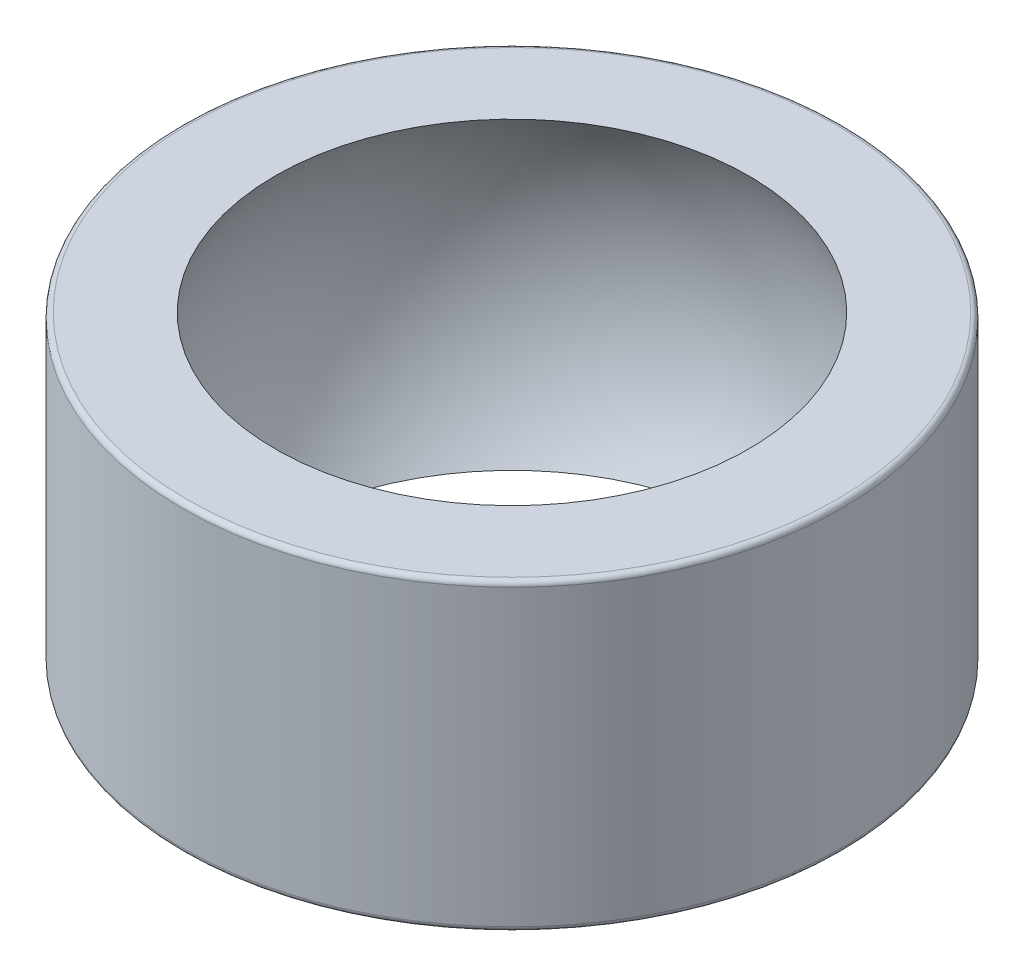
ISO-10303-21;
HEADER;
FILE_DESCRIPTION(('STEP AP214'),'2;1');
FILE_NAME('part.step','',(''),(''),'','','');
FILE_SCHEMA(('AUTOMOTIVE_DESIGN { 1 0 10303 214 1 1 1 1 }'));
ENDSEC;
DATA;
#1=APPLICATION_CONTEXT('core data for automotive mechanical design processes');
#2=APPLICATION_PROTOCOL_DEFINITION('international standard','automotive_design',2000,#1);
#3=PRODUCT_CONTEXT('',#1,'mechanical');
#4=PRODUCT('Part','Part','',(#3));
#5=PRODUCT_RELATED_PRODUCT_CATEGORY('part','',(#4));
#6=PRODUCT_DEFINITION_FORMATION('','',#4);
#7=PRODUCT_DEFINITION_CONTEXT('part definition',#1,'design');
#8=PRODUCT_DEFINITION('design','',#6,#7);
#9=PRODUCT_DEFINITION_SHAPE('','',#8);
#10=(LENGTH_UNIT() NAMED_UNIT(*) SI_UNIT(.MILLI.,.METRE.));
#11=(NAMED_UNIT(*) PLANE_ANGLE_UNIT() SI_UNIT($,.RADIAN.));
#12=(NAMED_UNIT(*) SI_UNIT($,.STERADIAN.) SOLID_ANGLE_UNIT());
#13=UNCERTAINTY_MEASURE_WITH_UNIT(LENGTH_MEASURE(1.E-05),#10,'distance_accuracy_value','');
#14=(GEOMETRIC_REPRESENTATION_CONTEXT(3) GLOBAL_UNCERTAINTY_ASSIGNED_CONTEXT((#13)) GLOBAL_UNIT_ASSIGNED_CONTEXT((#10,
#11,#12)) REPRESENTATION_CONTEXT('',''));
#15=CARTESIAN_POINT('',(0.,0.,0.));
#16=DIRECTION('',(0.,0.,1.));
#17=DIRECTION('',(1.,0.,0.));
#18=AXIS2_PLACEMENT_3D('',#15,#16,#17);
#19=CARTESIAN_POINT('',(0.,6.,0.));
#20=DIRECTION('',(0.,-1.,0.));
#21=DIRECTION('',(0.,0.,1.));
#22=AXIS2_PLACEMENT_3D('',#19,#20,#21);
#23=CYLINDRICAL_SURFACE('',#22,13.);
#24=CARTESIAN_POINT('',(0.,-5.8,0.));
#25=DIRECTION('',(0.,-1.,0.));
#26=DIRECTION('',(0.,0.,-1.));
#27=AXIS2_PLACEMENT_3D('',#24,#25,#26);
#28=CIRCLE('',#27,13.);
#29=CARTESIAN_POINT('',(0.,-5.8,-13.));
#30=VERTEX_POINT('',#29);
#31=EDGE_CURVE('E44',#30,#30,#28,.T.);
#32=ORIENTED_EDGE('',*,*,#31,.F.);
#33=EDGE_LOOP('',(#32));
#34=FACE_BOUND('',#33,.T.);
#35=CARTESIAN_POINT('',(0.,5.8,0.));
#36=DIRECTION('',(0.,-1.,0.));
#37=DIRECTION('',(0.,0.,-1.));
#38=AXIS2_PLACEMENT_3D('',#35,#36,#37);
#39=CIRCLE('',#38,13.);
#40=CARTESIAN_POINT('',(0.,5.8,-13.));
#41=VERTEX_POINT('',#40);
#42=EDGE_CURVE('E48',#41,#41,#39,.F.);
#43=ORIENTED_EDGE('',*,*,#42,.F.);
#44=EDGE_LOOP('',(#43));
#45=FACE_BOUND('',#44,.T.);
#46=ADVANCED_FACE('F33',(#34,#45),#23,.T.);
#47=CARTESIAN_POINT('',(0.,6.,0.));
#48=DIRECTION('',(0.,1.,0.));
#49=DIRECTION('',(0.,0.,-1.));
#50=AXIS2_PLACEMENT_3D('',#47,#48,#49);
#51=PLANE('',#50);
#52=CARTESIAN_POINT('',(0.,6.,0.));
#53=DIRECTION('',(0.,-1.,0.));
#54=DIRECTION('',(0.,0.,-1.));
#55=AXIS2_PLACEMENT_3D('',#52,#53,#54);
#56=CIRCLE('',#55,12.8);
#57=CARTESIAN_POINT('',(0.,6.,-12.8));
#58=VERTEX_POINT('',#57);
#59=EDGE_CURVE('E10',#58,#58,#56,.T.);
#60=ORIENTED_EDGE('',*,*,#59,.F.);
#61=EDGE_LOOP('',(#60));
#62=FACE_BOUND('',#61,.T.);
#63=CARTESIAN_POINT('',(0.,6.,0.));
#64=DIRECTION('',(0.,-1.,0.));
#65=DIRECTION('',(0.,0.,-1.));
#66=AXIS2_PLACEMENT_3D('',#63,#64,#65);
#67=CIRCLE('',#66,9.33862944976403);
#68=CARTESIAN_POINT('',(-9.33862944976403,6.,0.));
#69=VERTEX_POINT('',#68);
#70=EDGE_CURVE('E53',#69,#69,#67,.T.);
#71=ORIENTED_EDGE('',*,*,#70,.T.);
#72=EDGE_LOOP('',(#71));
#73=FACE_BOUND('',#72,.T.);
#74=ADVANCED_FACE('F60',(#62,#73),#51,.T.);
#75=CARTESIAN_POINT('',(0.,-6.,0.));
#76=DIRECTION('',(0.,1.,0.));
#77=DIRECTION('',(0.,0.,-1.));
#78=AXIS2_PLACEMENT_3D('',#75,#76,#77);
#79=PLANE('',#78);
#80=CARTESIAN_POINT('',(0.,-6.,0.));
#81=DIRECTION('',(0.,-1.,0.));
#82=DIRECTION('',(0.,0.,-1.));
#83=AXIS2_PLACEMENT_3D('',#80,#81,#82);
#84=CIRCLE('',#83,12.8);
#85=CARTESIAN_POINT('',(0.,-6.,-12.8));
#86=VERTEX_POINT('',#85);
#87=EDGE_CURVE('E40',#86,#86,#84,.F.);
#88=ORIENTED_EDGE('',*,*,#87,.F.);
#89=EDGE_LOOP('',(#88));
#90=FACE_BOUND('',#89,.T.);
#91=CARTESIAN_POINT('',(0.,-6.,0.));
#92=DIRECTION('',(0.,-1.,0.));
#93=DIRECTION('',(0.,0.,-1.));
#94=AXIS2_PLACEMENT_3D('',#91,#92,#93);
#95=CIRCLE('',#94,9.33862944976403);
#96=CARTESIAN_POINT('',(-9.33862944976403,-6.,0.));
#97=VERTEX_POINT('',#96);
#98=EDGE_CURVE('E54',#97,#97,#95,.T.);
#99=ORIENTED_EDGE('',*,*,#98,.F.);
#100=EDGE_LOOP('',(#99));
#101=FACE_BOUND('',#100,.T.);
#102=ADVANCED_FACE('F66',(#90,#101),#79,.F.);
#103=CARTESIAN_POINT('',(0.,0.,0.));
#104=DIRECTION('',(0.,-1.,0.));
#105=DIRECTION('',(-1.,0.,0.));
#106=AXIS2_PLACEMENT_3D('',#103,#104,#105);
#107=SPHERICAL_SURFACE('',#106,11.1);
#108=CARTESIAN_POINT('',(-9.33862944976403,6.,0.));
#109=CARTESIAN_POINT('',(-9.41001531016167,5.88889431043099,0.));
#110=CARTESIAN_POINT('',(-9.47941652590914,5.77651358064106,0.));
#111=CARTESIAN_POINT('',(-9.61416533603937,5.54934760873748,0.));
#112=CARTESIAN_POINT('',(-9.67951293042214,5.43456236662383,0.));
#113=CARTESIAN_POINT('',(-9.80607016575862,5.20273293819096,0.));
#114=CARTESIAN_POINT('',(-9.86727980671233,5.08568875187174,0.));
#115=CARTESIAN_POINT('',(-9.98548345769638,4.84949070133113,0.));
#116=CARTESIAN_POINT('',(-10.0424774677267,4.73033683710974,0.));
#117=CARTESIAN_POINT('',(-10.1521771785841,4.49007116450477,0.));
#118=CARTESIAN_POINT('',(-10.2048828794111,4.36895935612118,0.));
#119=CARTESIAN_POINT('',(-10.3059388554391,4.12493208191809,0.));
#120=CARTESIAN_POINT('',(-10.35428913064,4.00201661609858,0.));
#121=CARTESIAN_POINT('',(-10.4465726603908,3.75453859549077,0.));
#122=CARTESIAN_POINT('',(-10.4905059149408,3.62997604070246,0.));
#123=CARTESIAN_POINT('',(-10.5738994419726,3.37936251294451,0.));
#124=CARTESIAN_POINT('',(-10.6133597144544,3.25331153997487,0.));
#125=CARTESIAN_POINT('',(-10.6877570117823,2.9998817414805,0.));
#126=CARTESIAN_POINT('',(-10.7226940366284,2.87250291595576,0.));
#127=CARTESIAN_POINT('',(-10.7880003354185,2.61657966972225,0.));
#128=CARTESIAN_POINT('',(-10.8183696093625,2.48803524901347,0.));
#129=CARTESIAN_POINT('',(-10.8745017214238,2.22994455445644,0.));
#130=CARTESIAN_POINT('',(-10.900264559541,2.10039828060818,0.));
#131=CARTESIAN_POINT('',(-10.9471509828165,1.84046889801607,0.));
#132=CARTESIAN_POINT('',(-10.9682745679748,1.71008578927222,0.));
#133=CARTESIAN_POINT('',(-11.0058555777495,1.44864882110145,0.));
#134=CARTESIAN_POINT('',(-11.022313002366,1.31759496167452,0.));
#135=CARTESIAN_POINT('',(-11.0505407273113,1.05498343076525,0.));
#136=CARTESIAN_POINT('',(-11.0623110276401,0.923425759282917,0.));
#137=CARTESIAN_POINT('',(-11.0811495108019,0.659974184654419,0.));
#138=CARTESIAN_POINT('',(-11.0882176936349,0.528080281508257,0.));
#139=CARTESIAN_POINT('',(-11.0976429382339,0.264124252241397,0.));
#140=CARTESIAN_POINT('',(-11.1,0.132062126120699,0.));
#141=CARTESIAN_POINT('',(-11.1,-0.132062126120699,0.));
#142=CARTESIAN_POINT('',(-11.0976429382339,-0.264124252241397,0.));
#143=CARTESIAN_POINT('',(-11.0882176936349,-0.528080281508257,0.));
#144=CARTESIAN_POINT('',(-11.0811495108019,-0.659974184654419,0.));
#145=CARTESIAN_POINT('',(-11.0623110276401,-0.923425759282918,0.));
#146=CARTESIAN_POINT('',(-11.0505407273113,-1.05498343076525,0.));
#147=CARTESIAN_POINT('',(-11.022313002366,-1.31759496167452,0.));
#148=CARTESIAN_POINT('',(-11.0058555777495,-1.44864882110145,0.));
#149=CARTESIAN_POINT('',(-10.9682745679748,-1.71008578927222,0.));
#150=CARTESIAN_POINT('',(-10.9471509828165,-1.84046889801607,0.));
#151=CARTESIAN_POINT('',(-10.900264559541,-2.10039828060818,0.));
#152=CARTESIAN_POINT('',(-10.8745017214238,-2.22994455445643,0.));
#153=CARTESIAN_POINT('',(-10.8183696093625,-2.48803524901347,0.));
#154=CARTESIAN_POINT('',(-10.7880003354185,-2.61657966972225,0.));
#155=CARTESIAN_POINT('',(-10.7226940366284,-2.87250291595576,0.));
#156=CARTESIAN_POINT('',(-10.6877570117823,-2.9998817414805,0.));
#157=CARTESIAN_POINT('',(-10.6133597144544,-3.25331153997487,0.));
#158=CARTESIAN_POINT('',(-10.5738994419726,-3.37936251294451,0.));
#159=CARTESIAN_POINT('',(-10.4905059149408,-3.62997604070246,0.));
#160=CARTESIAN_POINT('',(-10.4465726603908,-3.75453859549077,0.));
#161=CARTESIAN_POINT('',(-10.35428913064,-4.00201661609858,0.));
#162=CARTESIAN_POINT('',(-10.3059388554391,-4.12493208191809,0.));
#163=CARTESIAN_POINT('',(-10.2048828794111,-4.36895935612118,0.));
#164=CARTESIAN_POINT('',(-10.1521771785841,-4.49007116450477,0.));
#165=CARTESIAN_POINT('',(-10.0424774677267,-4.73033683710974,0.));
#166=CARTESIAN_POINT('',(-9.98548345769638,-4.84949070133113,0.));
#167=CARTESIAN_POINT('',(-9.86727980671233,-5.08568875187174,0.));
#168=CARTESIAN_POINT('',(-9.80607016575862,-5.20273293819096,0.));
#169=CARTESIAN_POINT('',(-9.67951293042214,-5.43456236662383,0.));
#170=CARTESIAN_POINT('',(-9.61416533603937,-5.54934760873748,0.));
#171=CARTESIAN_POINT('',(-9.47941652590914,-5.77651358064106,0.));
#172=CARTESIAN_POINT('',(-9.41001531016167,-5.88889431043099,0.));
#173=CARTESIAN_POINT('',(-9.33862944976403,-6.,0.));
#174=B_SPLINE_CURVE_WITH_KNOTS('',3,(#108,#109,#110,#111,#112,#113,#114,#115,#116,#117,#118,
#119,#120,#121,#122,#123,#124,#125,#126,#127,#128,#129,#130,#131,#132,#133,#134,#135,#136,#137,
#138,#139,#140,#141,#142,#143,#144,#145,#146,#147,#148,#149,#150,#151,#152,#153,#154,#155,#156,
#157,#158,#159,#160,#161,#162,#163,#164,#165,#166,#167,#168,#169,#170,#171,#172,#173),
.UNSPECIFIED.,.F.,.F.,(4,2,2,2,2,2,2,2,2,2,2,2,2,2,2,2,2,2,2,2,2,2,2,2,2,2,2,2,2,2,2,2,4),(0.,
0.396165352165184,0.792330704330368,1.18849605649555,1.58466140866073,1.98082676082592,
2.3769921129911,2.77315746515628,3.16932281732147,3.56548816948665,3.96165352165184,
4.35781887381702,4.7539842259822,5.15014957814739,5.54631493031257,5.94248028247775,
6.33864563464294,6.73481098680812,7.1309763389733,7.52714169113849,7.92330704330367,
8.31947239546886,8.71563774763404,9.11180309979922,9.50796845196441,9.90413380412959,
10.3002991562948,10.69646450846,11.0926298606251,11.4887952127903,11.8849605649555,
12.2811259171207,12.6772912692859),.UNSPECIFIED.);
#175=EDGE_CURVE('BSEAM62',#69,#97,#174,.T.);
#176=ORIENTED_EDGE('',*,*,#70,.F.);
#177=ORIENTED_EDGE('',*,*,#98,.T.);
#178=ORIENTED_EDGE('',*,*,#175,.T.);
#179=ORIENTED_EDGE('',*,*,#175,.F.);
#180=EDGE_LOOP('',(#176,#178,#177,#179));
#181=FACE_BOUND('',#180,.T.);
#182=ADVANCED_FACE('F62',(#181),#107,.F.);
#183=CARTESIAN_POINT('',(0.,-5.8,0.));
#184=DIRECTION('',(0.,1.,0.));
#185=DIRECTION('',(0.,0.,-1.));
#186=AXIS2_PLACEMENT_3D('',#183,#184,#185);
#187=TOROIDAL_SURFACE('',#186,12.8,0.2);
#188=ORIENTED_EDGE('',*,*,#87,.T.);
#189=EDGE_LOOP('',(#188));
#190=FACE_BOUND('',#189,.T.);
#191=ORIENTED_EDGE('',*,*,#31,.T.);
#192=EDGE_LOOP('',(#191));
#193=FACE_BOUND('',#192,.T.);
#194=ADVANCED_FACE('F65',(#190,#193),#187,.T.);
#195=CARTESIAN_POINT('',(0.,5.8,0.));
#196=DIRECTION('',(0.,1.,0.));
#197=DIRECTION('',(0.,0.,-1.));
#198=AXIS2_PLACEMENT_3D('',#195,#196,#197);
#199=TOROIDAL_SURFACE('',#198,12.8,0.2);
#200=ORIENTED_EDGE('',*,*,#42,.T.);
#201=EDGE_LOOP('',(#200));
#202=FACE_BOUND('',#201,.T.);
#203=ORIENTED_EDGE('',*,*,#59,.T.);
#204=EDGE_LOOP('',(#203));
#205=FACE_BOUND('',#204,.T.);
#206=ADVANCED_FACE('F35',(#202,#205),#199,.T.);
#207=CLOSED_SHELL('',(#46,#74,#102,#182,#194,#206));
#208=MANIFOLD_SOLID_BREP('B2',#207);
#209=ADVANCED_BREP_SHAPE_REPRESENTATION('',(#18,#208),#14);
#210=SHAPE_DEFINITION_REPRESENTATION(#9,#209);
ENDSEC;
END-ISO-10303-21;
